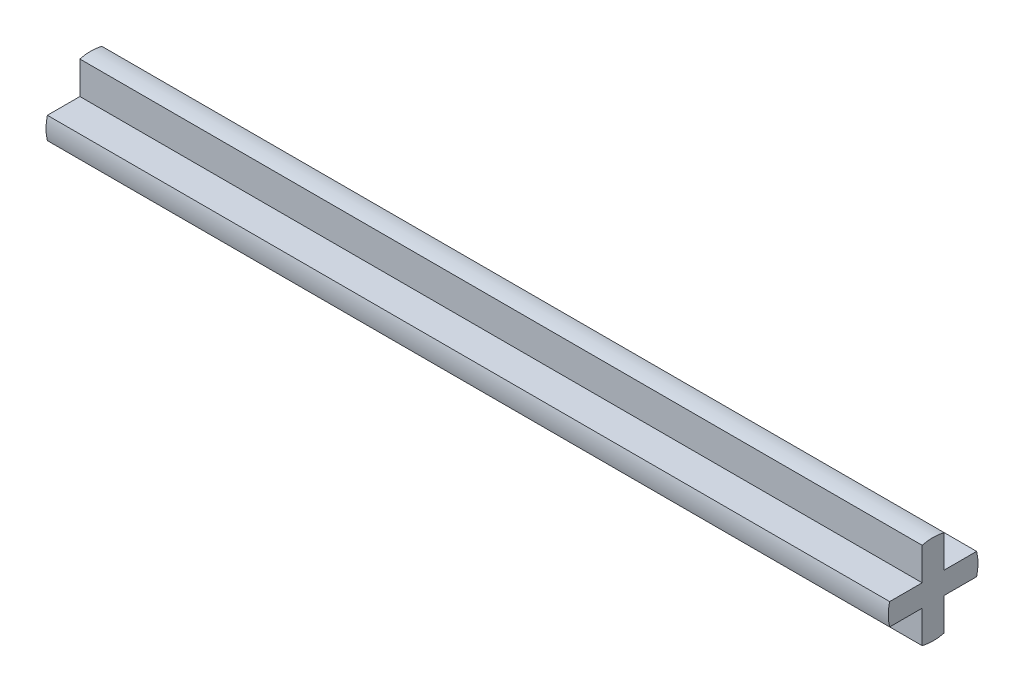
ISO-10303-21;
HEADER;
FILE_DESCRIPTION(('STEP AP214'),'2;1');
FILE_NAME('part.step','',(''),(''),'','','');
FILE_SCHEMA(('AUTOMOTIVE_DESIGN { 1 0 10303 214 1 1 1 1 }'));
ENDSEC;
DATA;
#1=APPLICATION_CONTEXT('core data for automotive mechanical design processes');
#2=APPLICATION_PROTOCOL_DEFINITION('international standard','automotive_design',2000,#1);
#3=PRODUCT_CONTEXT('',#1,'mechanical');
#4=PRODUCT('Part','Part','',(#3));
#5=PRODUCT_RELATED_PRODUCT_CATEGORY('part','',(#4));
#6=PRODUCT_DEFINITION_FORMATION('','',#4);
#7=PRODUCT_DEFINITION_CONTEXT('part definition',#1,'design');
#8=PRODUCT_DEFINITION('design','',#6,#7);
#9=PRODUCT_DEFINITION_SHAPE('','',#8);
#10=(LENGTH_UNIT() NAMED_UNIT(*) SI_UNIT(.MILLI.,.METRE.));
#11=(NAMED_UNIT(*) PLANE_ANGLE_UNIT() SI_UNIT($,.RADIAN.));
#12=(NAMED_UNIT(*) SI_UNIT($,.STERADIAN.) SOLID_ANGLE_UNIT());
#13=UNCERTAINTY_MEASURE_WITH_UNIT(LENGTH_MEASURE(1.E-05),#10,'distance_accuracy_value','');
#14=(GEOMETRIC_REPRESENTATION_CONTEXT(3) GLOBAL_UNCERTAINTY_ASSIGNED_CONTEXT((#13)) GLOBAL_UNIT_ASSIGNED_CONTEXT((#10,
#11,#12)) REPRESENTATION_CONTEXT('',''));
#15=CARTESIAN_POINT('',(0.,0.,0.));
#16=DIRECTION('',(0.,0.,1.));
#17=DIRECTION('',(1.,0.,0.));
#18=AXIS2_PLACEMENT_3D('',#15,#16,#17);
#19=CARTESIAN_POINT('',(23.,0.,0.));
#20=DIRECTION('',(-1.,0.,0.));
#21=DIRECTION('',(0.,0.,1.));
#22=AXIS2_PLACEMENT_3D('',#19,#20,#21);
#23=CYLINDRICAL_SURFACE('',#22,2.45);
#24=DIRECTION('',(-1.,0.,0.));
#25=VECTOR('',#24,1.);
#26=CARTESIAN_POINT('',(23.,0.6,2.37539470404394));
#27=LINE('',#26,#25);
#28=CARTESIAN_POINT('',(-23.,0.6,2.37539470404394));
#29=VERTEX_POINT('',#28);
#30=CARTESIAN_POINT('',(23.,0.6,2.37539470404394));
#31=VERTEX_POINT('',#30);
#32=EDGE_CURVE('E192',#29,#31,#27,.F.);
#33=ORIENTED_EDGE('',*,*,#32,.F.);
#34=CARTESIAN_POINT('',(-23.,0.,0.));
#35=DIRECTION('',(1.,0.,0.));
#36=DIRECTION('',(0.,0.,-1.));
#37=AXIS2_PLACEMENT_3D('',#34,#35,#36);
#38=CIRCLE('',#37,2.45);
#39=CARTESIAN_POINT('',(-23.,-0.6,2.37539470404394));
#40=VERTEX_POINT('',#39);
#41=EDGE_CURVE('E216',#29,#40,#38,.T.);
#42=ORIENTED_EDGE('',*,*,#41,.T.);
#43=DIRECTION('',(-1.,0.,0.));
#44=VECTOR('',#43,1.);
#45=CARTESIAN_POINT('',(23.,-0.6,2.37539470404394));
#46=LINE('',#45,#44);
#47=CARTESIAN_POINT('',(23.,-0.6,2.37539470404394));
#48=VERTEX_POINT('',#47);
#49=EDGE_CURVE('E58',#48,#40,#46,.T.);
#50=ORIENTED_EDGE('',*,*,#49,.F.);
#51=CARTESIAN_POINT('',(23.,0.,0.));
#52=DIRECTION('',(1.,0.,0.));
#53=DIRECTION('',(0.,0.,-1.));
#54=AXIS2_PLACEMENT_3D('',#51,#52,#53);
#55=CIRCLE('',#54,2.45);
#56=EDGE_CURVE('E235',#31,#48,#55,.T.);
#57=ORIENTED_EDGE('',*,*,#56,.F.);
#58=EDGE_LOOP('',(#33,#42,#50,#57));
#59=FACE_BOUND('',#58,.T.);
#60=ADVANCED_FACE('F36',(#59),#23,.T.);
#61=DIRECTION('',(-1.,0.,0.));
#62=VECTOR('',#61,1.);
#63=CARTESIAN_POINT('',(23.,2.37539470404394,0.6));
#64=LINE('',#63,#62);
#65=CARTESIAN_POINT('',(23.,2.37539470404394,0.6));
#66=VERTEX_POINT('',#65);
#67=CARTESIAN_POINT('',(-23.,2.37539470404394,0.6));
#68=VERTEX_POINT('',#67);
#69=EDGE_CURVE('E190',#66,#68,#64,.T.);
#70=ORIENTED_EDGE('',*,*,#69,.F.);
#71=CARTESIAN_POINT('',(23.,2.37539470404394,-0.600000000000001));
#72=VERTEX_POINT('',#71);
#73=EDGE_CURVE('E199',#72,#66,#55,.T.);
#74=ORIENTED_EDGE('',*,*,#73,.F.);
#75=DIRECTION('',(-1.,0.,0.));
#76=VECTOR('',#75,1.);
#77=CARTESIAN_POINT('',(23.,2.37539470404394,-0.600000000000001));
#78=LINE('',#77,#76);
#79=CARTESIAN_POINT('',(-23.,2.37539470404394,-0.600000000000001));
#80=VERTEX_POINT('',#79);
#81=EDGE_CURVE('E188',#80,#72,#78,.F.);
#82=ORIENTED_EDGE('',*,*,#81,.F.);
#83=EDGE_CURVE('E198',#80,#68,#38,.T.);
#84=ORIENTED_EDGE('',*,*,#83,.T.);
#85=EDGE_LOOP('',(#70,#74,#82,#84));
#86=FACE_BOUND('',#85,.T.);
#87=ADVANCED_FACE('F243',(#86),#23,.T.);
#88=DIRECTION('',(-1.,0.,0.));
#89=VECTOR('',#88,1.);
#90=CARTESIAN_POINT('',(23.,0.6,-2.37539470404394));
#91=LINE('',#90,#89);
#92=CARTESIAN_POINT('',(23.,0.6,-2.37539470404394));
#93=VERTEX_POINT('',#92);
#94=CARTESIAN_POINT('',(-23.,0.6,-2.37539470404394));
#95=VERTEX_POINT('',#94);
#96=EDGE_CURVE('E186',#93,#95,#91,.T.);
#97=ORIENTED_EDGE('',*,*,#96,.F.);
#98=CARTESIAN_POINT('',(23.,-0.600000000000001,-2.37539470404394));
#99=VERTEX_POINT('',#98);
#100=EDGE_CURVE('E194',#99,#93,#55,.T.);
#101=ORIENTED_EDGE('',*,*,#100,.F.);
#102=DIRECTION('',(-1.,0.,0.));
#103=VECTOR('',#102,1.);
#104=CARTESIAN_POINT('',(23.,-0.600000000000001,-2.37539470404394));
#105=LINE('',#104,#103);
#106=CARTESIAN_POINT('',(-23.,-0.600000000000001,-2.37539470404394));
#107=VERTEX_POINT('',#106);
#108=EDGE_CURVE('E184',#107,#99,#105,.F.);
#109=ORIENTED_EDGE('',*,*,#108,.F.);
#110=EDGE_CURVE('E146',#107,#95,#38,.T.);
#111=ORIENTED_EDGE('',*,*,#110,.T.);
#112=EDGE_LOOP('',(#97,#101,#109,#111));
#113=FACE_BOUND('',#112,.T.);
#114=ADVANCED_FACE('F241',(#113),#23,.T.);
#115=DIRECTION('',(-1.,0.,0.));
#116=VECTOR('',#115,1.);
#117=CARTESIAN_POINT('',(23.,-2.37539470404394,-0.600000000000001));
#118=LINE('',#117,#116);
#119=CARTESIAN_POINT('',(23.,-2.37539470404394,-0.600000000000001));
#120=VERTEX_POINT('',#119);
#121=CARTESIAN_POINT('',(-23.,-2.37539470404394,-0.600000000000001));
#122=VERTEX_POINT('',#121);
#123=EDGE_CURVE('E50',#120,#122,#118,.T.);
#124=ORIENTED_EDGE('',*,*,#123,.F.);
#125=CARTESIAN_POINT('',(23.,-2.37539470404394,0.599999999999998));
#126=VERTEX_POINT('',#125);
#127=EDGE_CURVE('E197',#126,#120,#55,.T.);
#128=ORIENTED_EDGE('',*,*,#127,.F.);
#129=DIRECTION('',(-1.,0.,0.));
#130=VECTOR('',#129,1.);
#131=CARTESIAN_POINT('',(23.,-2.37539470404394,0.599999999999998));
#132=LINE('',#131,#130);
#133=CARTESIAN_POINT('',(-23.,-2.37539470404394,0.599999999999998));
#134=VERTEX_POINT('',#133);
#135=EDGE_CURVE('E181',#134,#126,#132,.F.);
#136=ORIENTED_EDGE('',*,*,#135,.F.);
#137=EDGE_CURVE('E201',#134,#122,#38,.T.);
#138=ORIENTED_EDGE('',*,*,#137,.T.);
#139=EDGE_LOOP('',(#124,#128,#136,#138));
#140=FACE_BOUND('',#139,.T.);
#141=ADVANCED_FACE('F223',(#140),#23,.T.);
#142=CARTESIAN_POINT('',(23.,0.,0.));
#143=DIRECTION('',(1.,0.,0.));
#144=DIRECTION('',(0.,0.,-1.));
#145=AXIS2_PLACEMENT_3D('',#142,#143,#144);
#146=PLANE('',#145);
#147=DIRECTION('',(0.,-1.,0.));
#148=VECTOR('',#147,1.);
#149=CARTESIAN_POINT('',(23.,0.6,0.6));
#150=LINE('',#149,#148);
#151=CARTESIAN_POINT('',(23.,0.6,0.6));
#152=VERTEX_POINT('',#151);
#153=EDGE_CURVE('E171',#66,#152,#150,.T.);
#154=ORIENTED_EDGE('',*,*,#153,.T.);
#155=DIRECTION('',(0.,0.,1.));
#156=VECTOR('',#155,1.);
#157=CARTESIAN_POINT('',(23.,0.6,3.));
#158=LINE('',#157,#156);
#159=EDGE_CURVE('E152',#152,#31,#158,.T.);
#160=ORIENTED_EDGE('',*,*,#159,.T.);
#161=ORIENTED_EDGE('',*,*,#56,.T.);
#162=DIRECTION('',(0.,0.,-1.));
#163=VECTOR('',#162,1.);
#164=CARTESIAN_POINT('',(23.,-0.6,0.599999999999998));
#165=LINE('',#164,#163);
#166=CARTESIAN_POINT('',(23.,-0.6,0.599999999999998));
#167=VERTEX_POINT('',#166);
#168=EDGE_CURVE('E156',#48,#167,#165,.T.);
#169=ORIENTED_EDGE('',*,*,#168,.T.);
#170=DIRECTION('',(0.,-1.,0.));
#171=VECTOR('',#170,1.);
#172=CARTESIAN_POINT('',(23.,-0.6,0.599999999999998));
#173=LINE('',#172,#171);
#174=EDGE_CURVE('E159',#167,#126,#173,.T.);
#175=ORIENTED_EDGE('',*,*,#174,.T.);
#176=ORIENTED_EDGE('',*,*,#127,.T.);
#177=DIRECTION('',(0.,1.,0.));
#178=VECTOR('',#177,1.);
#179=CARTESIAN_POINT('',(23.,-0.600000000000001,-0.600000000000001));
#180=LINE('',#179,#178);
#181=CARTESIAN_POINT('',(23.,-0.600000000000001,-0.600000000000001));
#182=VERTEX_POINT('',#181);
#183=EDGE_CURVE('E162',#120,#182,#180,.T.);
#184=ORIENTED_EDGE('',*,*,#183,.T.);
#185=DIRECTION('',(0.,0.,-1.));
#186=VECTOR('',#185,1.);
#187=CARTESIAN_POINT('',(23.,-0.600000000000001,-0.600000000000001));
#188=LINE('',#187,#186);
#189=EDGE_CURVE('E136',#182,#99,#188,.T.);
#190=ORIENTED_EDGE('',*,*,#189,.T.);
#191=ORIENTED_EDGE('',*,*,#100,.T.);
#192=DIRECTION('',(0.,0.,1.));
#193=VECTOR('',#192,1.);
#194=CARTESIAN_POINT('',(23.,0.6,-0.600000000000001));
#195=LINE('',#194,#193);
#196=CARTESIAN_POINT('',(23.,0.6,-0.600000000000001));
#197=VERTEX_POINT('',#196);
#198=EDGE_CURVE('E165',#93,#197,#195,.T.);
#199=ORIENTED_EDGE('',*,*,#198,.T.);
#200=DIRECTION('',(0.,1.,0.));
#201=VECTOR('',#200,1.);
#202=CARTESIAN_POINT('',(23.,0.6,-0.600000000000001));
#203=LINE('',#202,#201);
#204=EDGE_CURVE('E168',#197,#72,#203,.T.);
#205=ORIENTED_EDGE('',*,*,#204,.T.);
#206=ORIENTED_EDGE('',*,*,#73,.T.);
#207=EDGE_LOOP('',(#154,#160,#161,#169,#175,#176,#184,#190,#191,#199,#205,#206));
#208=FACE_BOUND('',#207,.T.);
#209=ADVANCED_FACE('F236',(#208),#146,.T.);
#210=CARTESIAN_POINT('',(-23.,0.,0.));
#211=DIRECTION('',(1.,0.,0.));
#212=DIRECTION('',(0.,0.,-1.));
#213=AXIS2_PLACEMENT_3D('',#210,#211,#212);
#214=PLANE('',#213);
#215=DIRECTION('',(0.,0.,1.));
#216=VECTOR('',#215,1.);
#217=CARTESIAN_POINT('',(-23.,0.6,3.));
#218=LINE('',#217,#216);
#219=CARTESIAN_POINT('',(-23.,0.6,0.6));
#220=VERTEX_POINT('',#219);
#221=EDGE_CURVE('E150',#220,#29,#218,.T.);
#222=ORIENTED_EDGE('',*,*,#221,.F.);
#223=DIRECTION('',(0.,-1.,0.));
#224=VECTOR('',#223,1.);
#225=CARTESIAN_POINT('',(-23.,0.,0.6));
#226=LINE('',#225,#224);
#227=EDGE_CURVE('E12',#68,#220,#226,.T.);
#228=ORIENTED_EDGE('',*,*,#227,.F.);
#229=ORIENTED_EDGE('',*,*,#83,.F.);
#230=DIRECTION('',(0.,1.,0.));
#231=VECTOR('',#230,1.);
#232=CARTESIAN_POINT('',(-23.,0.6,-0.600000000000001));
#233=LINE('',#232,#231);
#234=CARTESIAN_POINT('',(-23.,0.6,-0.600000000000001));
#235=VERTEX_POINT('',#234);
#236=EDGE_CURVE('E147',#235,#80,#233,.T.);
#237=ORIENTED_EDGE('',*,*,#236,.F.);
#238=DIRECTION('',(0.,0.,1.));
#239=VECTOR('',#238,1.);
#240=CARTESIAN_POINT('',(-23.,0.6,0.));
#241=LINE('',#240,#239);
#242=EDGE_CURVE('E43',#95,#235,#241,.T.);
#243=ORIENTED_EDGE('',*,*,#242,.F.);
#244=ORIENTED_EDGE('',*,*,#110,.F.);
#245=DIRECTION('',(0.,0.,-1.));
#246=VECTOR('',#245,1.);
#247=CARTESIAN_POINT('',(-23.,-0.600000000000001,-0.600000000000001));
#248=LINE('',#247,#246);
#249=CARTESIAN_POINT('',(-23.,-0.600000000000001,-0.600000000000001));
#250=VERTEX_POINT('',#249);
#251=EDGE_CURVE('E133',#250,#107,#248,.T.);
#252=ORIENTED_EDGE('',*,*,#251,.F.);
#253=DIRECTION('',(0.,1.,0.));
#254=VECTOR('',#253,1.);
#255=CARTESIAN_POINT('',(-23.,0.,-0.600000000000001));
#256=LINE('',#255,#254);
#257=EDGE_CURVE('E120',#122,#250,#256,.T.);
#258=ORIENTED_EDGE('',*,*,#257,.F.);
#259=ORIENTED_EDGE('',*,*,#137,.F.);
#260=DIRECTION('',(0.,-1.,0.));
#261=VECTOR('',#260,1.);
#262=CARTESIAN_POINT('',(-23.,-0.6,0.599999999999998));
#263=LINE('',#262,#261);
#264=CARTESIAN_POINT('',(-23.,-0.6,0.599999999999998));
#265=VERTEX_POINT('',#264);
#266=EDGE_CURVE('E148',#265,#134,#263,.T.);
#267=ORIENTED_EDGE('',*,*,#266,.F.);
#268=DIRECTION('',(0.,0.,-1.));
#269=VECTOR('',#268,1.);
#270=CARTESIAN_POINT('',(-23.,-0.6,0.));
#271=LINE('',#270,#269);
#272=EDGE_CURVE('E129',#40,#265,#271,.T.);
#273=ORIENTED_EDGE('',*,*,#272,.F.);
#274=ORIENTED_EDGE('',*,*,#41,.F.);
#275=EDGE_LOOP('',(#222,#228,#229,#237,#243,#244,#252,#258,#259,#267,#273,#274));
#276=FACE_BOUND('',#275,.T.);
#277=ADVANCED_FACE('F143',(#276),#214,.F.);
#278=CARTESIAN_POINT('',(-23.,-0.6,0.599999999999998));
#279=DIRECTION('',(0.,-1.,0.));
#280=DIRECTION('',(0.,0.,-1.));
#281=AXIS2_PLACEMENT_3D('',#278,#279,#280);
#282=PLANE('',#281);
#283=ORIENTED_EDGE('',*,*,#49,.T.);
#284=ORIENTED_EDGE('',*,*,#272,.T.);
#285=DIRECTION('',(1.,0.,0.));
#286=VECTOR('',#285,1.);
#287=CARTESIAN_POINT('',(-23.,-0.6,0.599999999999998));
#288=LINE('',#287,#286);
#289=EDGE_CURVE('E139',#265,#167,#288,.T.);
#290=ORIENTED_EDGE('',*,*,#289,.T.);
#291=ORIENTED_EDGE('',*,*,#168,.F.);
#292=EDGE_LOOP('',(#283,#284,#290,#291));
#293=FACE_BOUND('',#292,.T.);
#294=ADVANCED_FACE('F231',(#293),#282,.T.);
#295=CARTESIAN_POINT('',(-23.,-0.6,0.599999999999998));
#296=DIRECTION('',(0.,0.,1.));
#297=DIRECTION('',(0.,-1.,0.));
#298=AXIS2_PLACEMENT_3D('',#295,#296,#297);
#299=PLANE('',#298);
#300=ORIENTED_EDGE('',*,*,#135,.T.);
#301=ORIENTED_EDGE('',*,*,#174,.F.);
#302=ORIENTED_EDGE('',*,*,#289,.F.);
#303=ORIENTED_EDGE('',*,*,#266,.T.);
#304=EDGE_LOOP('',(#300,#301,#302,#303));
#305=FACE_BOUND('',#304,.T.);
#306=ADVANCED_FACE('F229',(#305),#299,.T.);
#307=CARTESIAN_POINT('',(-23.,-0.600000000000001,-0.600000000000001));
#308=DIRECTION('',(0.,0.,-1.));
#309=DIRECTION('',(0.,1.,0.));
#310=AXIS2_PLACEMENT_3D('',#307,#308,#309);
#311=PLANE('',#310);
#312=ORIENTED_EDGE('',*,*,#123,.T.);
#313=ORIENTED_EDGE('',*,*,#257,.T.);
#314=DIRECTION('',(1.,0.,0.));
#315=VECTOR('',#314,1.);
#316=CARTESIAN_POINT('',(-23.,-0.600000000000001,-0.600000000000001));
#317=LINE('',#316,#315);
#318=EDGE_CURVE('E123',#250,#182,#317,.T.);
#319=ORIENTED_EDGE('',*,*,#318,.T.);
#320=ORIENTED_EDGE('',*,*,#183,.F.);
#321=EDGE_LOOP('',(#312,#313,#319,#320));
#322=FACE_BOUND('',#321,.T.);
#323=ADVANCED_FACE('F122',(#322),#311,.T.);
#324=CARTESIAN_POINT('',(-23.,-0.600000000000001,-0.600000000000001));
#325=DIRECTION('',(0.,-1.,0.));
#326=DIRECTION('',(0.,0.,-1.));
#327=AXIS2_PLACEMENT_3D('',#324,#325,#326);
#328=PLANE('',#327);
#329=ORIENTED_EDGE('',*,*,#108,.T.);
#330=ORIENTED_EDGE('',*,*,#189,.F.);
#331=ORIENTED_EDGE('',*,*,#318,.F.);
#332=ORIENTED_EDGE('',*,*,#251,.T.);
#333=EDGE_LOOP('',(#329,#330,#331,#332));
#334=FACE_BOUND('',#333,.T.);
#335=ADVANCED_FACE('F132',(#334),#328,.T.);
#336=CARTESIAN_POINT('',(-23.,0.6,-0.600000000000001));
#337=DIRECTION('',(0.,1.,0.));
#338=DIRECTION('',(0.,0.,1.));
#339=AXIS2_PLACEMENT_3D('',#336,#337,#338);
#340=PLANE('',#339);
#341=ORIENTED_EDGE('',*,*,#96,.T.);
#342=ORIENTED_EDGE('',*,*,#242,.T.);
#343=DIRECTION('',(1.,0.,0.));
#344=VECTOR('',#343,1.);
#345=CARTESIAN_POINT('',(-23.,0.6,-0.600000000000001));
#346=LINE('',#345,#344);
#347=EDGE_CURVE('E138',#235,#197,#346,.T.);
#348=ORIENTED_EDGE('',*,*,#347,.T.);
#349=ORIENTED_EDGE('',*,*,#198,.F.);
#350=EDGE_LOOP('',(#341,#342,#348,#349));
#351=FACE_BOUND('',#350,.T.);
#352=ADVANCED_FACE('F204',(#351),#340,.T.);
#353=CARTESIAN_POINT('',(-23.,0.6,-0.600000000000001));
#354=DIRECTION('',(0.,0.,-1.));
#355=DIRECTION('',(-1.,0.,0.));
#356=AXIS2_PLACEMENT_3D('',#353,#354,#355);
#357=PLANE('',#356);
#358=ORIENTED_EDGE('',*,*,#81,.T.);
#359=ORIENTED_EDGE('',*,*,#204,.F.);
#360=ORIENTED_EDGE('',*,*,#347,.F.);
#361=ORIENTED_EDGE('',*,*,#236,.T.);
#362=EDGE_LOOP('',(#358,#359,#360,#361));
#363=FACE_BOUND('',#362,.T.);
#364=ADVANCED_FACE('F209',(#363),#357,.T.);
#365=CARTESIAN_POINT('',(-23.,0.6,3.));
#366=DIRECTION('',(0.,1.,0.));
#367=DIRECTION('',(0.,0.,1.));
#368=AXIS2_PLACEMENT_3D('',#365,#366,#367);
#369=PLANE('',#368);
#370=ORIENTED_EDGE('',*,*,#32,.T.);
#371=ORIENTED_EDGE('',*,*,#159,.F.);
#372=DIRECTION('',(1.,0.,0.));
#373=VECTOR('',#372,1.);
#374=CARTESIAN_POINT('',(-23.,0.6,0.6));
#375=LINE('',#374,#373);
#376=EDGE_CURVE('E176',#220,#152,#375,.T.);
#377=ORIENTED_EDGE('',*,*,#376,.F.);
#378=ORIENTED_EDGE('',*,*,#221,.T.);
#379=EDGE_LOOP('',(#370,#371,#377,#378));
#380=FACE_BOUND('',#379,.T.);
#381=ADVANCED_FACE('F329',(#380),#369,.T.);
#382=CARTESIAN_POINT('',(-23.,0.6,0.6));
#383=DIRECTION('',(0.,0.,1.));
#384=DIRECTION('',(1.,0.,0.));
#385=AXIS2_PLACEMENT_3D('',#382,#383,#384);
#386=PLANE('',#385);
#387=ORIENTED_EDGE('',*,*,#69,.T.);
#388=ORIENTED_EDGE('',*,*,#227,.T.);
#389=ORIENTED_EDGE('',*,*,#376,.T.);
#390=ORIENTED_EDGE('',*,*,#153,.F.);
#391=EDGE_LOOP('',(#387,#388,#389,#390));
#392=FACE_BOUND('',#391,.T.);
#393=ADVANCED_FACE('F338',(#392),#386,.T.);
#394=CLOSED_SHELL('',(#60,#87,#114,#141,#209,#277,#294,#306,#323,#335,#352,#364,#381,#393));
#395=MANIFOLD_SOLID_BREP('B2',#394);
#396=ADVANCED_BREP_SHAPE_REPRESENTATION('',(#18,#395),#14);
#397=SHAPE_DEFINITION_REPRESENTATION(#9,#396);
ENDSEC;
END-ISO-10303-21;
